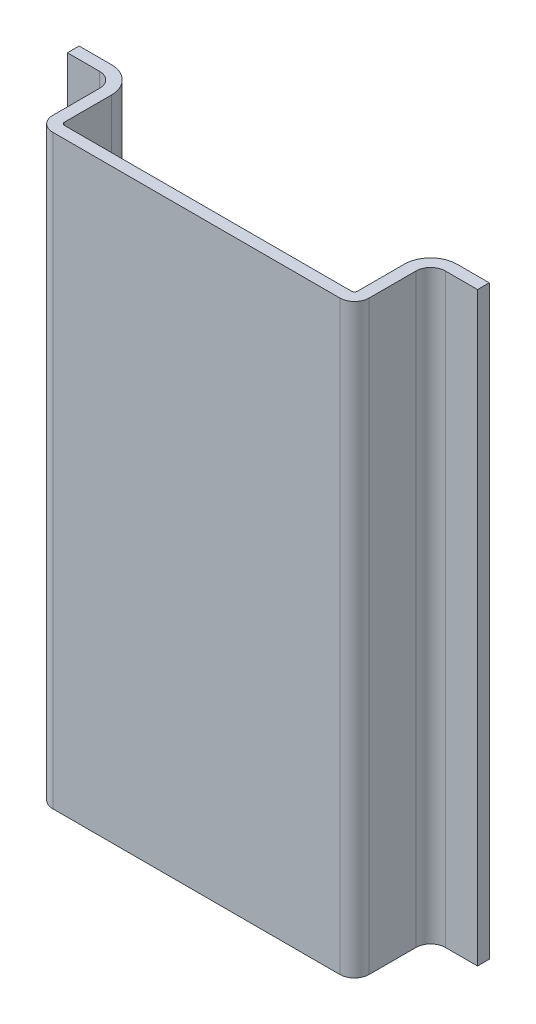
ISO-10303-21;
HEADER;
FILE_DESCRIPTION(('STEP AP214'),'2;1');
FILE_NAME('part.step','',(''),(''),'','','');
FILE_SCHEMA(('AUTOMOTIVE_DESIGN { 1 0 10303 214 1 1 1 1 }'));
ENDSEC;
DATA;
#1=APPLICATION_CONTEXT('core data for automotive mechanical design processes');
#2=APPLICATION_PROTOCOL_DEFINITION('international standard','automotive_design',2000,#1);
#3=PRODUCT_CONTEXT('',#1,'mechanical');
#4=PRODUCT('Part','Part','',(#3));
#5=PRODUCT_RELATED_PRODUCT_CATEGORY('part','',(#4));
#6=PRODUCT_DEFINITION_FORMATION('','',#4);
#7=PRODUCT_DEFINITION_CONTEXT('part definition',#1,'design');
#8=PRODUCT_DEFINITION('design','',#6,#7);
#9=PRODUCT_DEFINITION_SHAPE('','',#8);
#10=(LENGTH_UNIT() NAMED_UNIT(*) SI_UNIT(.MILLI.,.METRE.));
#11=(NAMED_UNIT(*) PLANE_ANGLE_UNIT() SI_UNIT($,.RADIAN.));
#12=(NAMED_UNIT(*) SI_UNIT($,.STERADIAN.) SOLID_ANGLE_UNIT());
#13=UNCERTAINTY_MEASURE_WITH_UNIT(LENGTH_MEASURE(1.E-05),#10,'distance_accuracy_value','');
#14=(GEOMETRIC_REPRESENTATION_CONTEXT(3) GLOBAL_UNCERTAINTY_ASSIGNED_CONTEXT((#13)) GLOBAL_UNIT_ASSIGNED_CONTEXT((#10,
#11,#12)) REPRESENTATION_CONTEXT('',''));
#15=CARTESIAN_POINT('',(0.,0.,0.));
#16=DIRECTION('',(0.,0.,1.));
#17=DIRECTION('',(1.,0.,0.));
#18=AXIS2_PLACEMENT_3D('',#15,#16,#17);
#19=CARTESIAN_POINT('',(17.5,50.,-6.50000000000017));
#20=DIRECTION('',(-1.,0.,0.));
#21=DIRECTION('',(0.,0.,1.));
#22=AXIS2_PLACEMENT_3D('',#19,#20,#21);
#23=PLANE('',#22);
#24=DIRECTION('',(0.,0.,-1.));
#25=VECTOR('',#24,1.);
#26=CARTESIAN_POINT('',(17.5,0.,-6.50000000000017));
#27=LINE('',#26,#25);
#28=CARTESIAN_POINT('',(17.5,0.,-6.50000000000017));
#29=VERTEX_POINT('',#28);
#30=CARTESIAN_POINT('',(17.5,0.,-7.5));
#31=VERTEX_POINT('',#30);
#32=EDGE_CURVE('E270',#29,#31,#27,.T.);
#33=ORIENTED_EDGE('',*,*,#32,.T.);
#34=DIRECTION('',(0.,-1.,0.));
#35=VECTOR('',#34,1.);
#36=CARTESIAN_POINT('',(17.5,50.,-7.5));
#37=LINE('',#36,#35);
#38=CARTESIAN_POINT('',(17.5,50.,-7.5));
#39=VERTEX_POINT('',#38);
#40=EDGE_CURVE('E13',#39,#31,#37,.T.);
#41=ORIENTED_EDGE('',*,*,#40,.F.);
#42=DIRECTION('',(0.,0.,-1.));
#43=VECTOR('',#42,1.);
#44=CARTESIAN_POINT('',(17.5,50.,-6.50000000000017));
#45=LINE('',#44,#43);
#46=CARTESIAN_POINT('',(17.5,50.,-6.50000000000017));
#47=VERTEX_POINT('',#46);
#48=EDGE_CURVE('E308',#47,#39,#45,.T.);
#49=ORIENTED_EDGE('',*,*,#48,.F.);
#50=DIRECTION('',(0.,-1.,0.));
#51=VECTOR('',#50,1.);
#52=CARTESIAN_POINT('',(17.5,50.,-6.50000000000017));
#53=LINE('',#52,#51);
#54=EDGE_CURVE('E266',#47,#29,#53,.T.);
#55=ORIENTED_EDGE('',*,*,#54,.T.);
#56=EDGE_LOOP('',(#33,#41,#49,#55));
#57=FACE_BOUND('',#56,.T.);
#58=ADVANCED_FACE('F102',(#57),#23,.F.);
#59=CARTESIAN_POINT('',(14.75,50.,-7.5));
#60=DIRECTION('',(0.,0.,1.));
#61=DIRECTION('',(1.,0.,0.));
#62=AXIS2_PLACEMENT_3D('',#59,#60,#61);
#63=PLANE('',#62);
#64=DIRECTION('',(-1.,0.,0.));
#65=VECTOR('',#64,1.);
#66=CARTESIAN_POINT('',(14.75,0.,-7.5));
#67=LINE('',#66,#65);
#68=CARTESIAN_POINT('',(14.75,0.,-7.5));
#69=VERTEX_POINT('',#68);
#70=EDGE_CURVE('E273',#31,#69,#67,.T.);
#71=ORIENTED_EDGE('',*,*,#70,.T.);
#72=DIRECTION('',(0.,-1.,0.));
#73=VECTOR('',#72,1.);
#74=CARTESIAN_POINT('',(14.75,50.,-7.5));
#75=LINE('',#74,#73);
#76=CARTESIAN_POINT('',(14.75,50.,-7.5));
#77=VERTEX_POINT('',#76);
#78=EDGE_CURVE('E110',#77,#69,#75,.T.);
#79=ORIENTED_EDGE('',*,*,#78,.F.);
#80=DIRECTION('',(-1.,0.,0.));
#81=VECTOR('',#80,1.);
#82=CARTESIAN_POINT('',(14.75,50.,-7.5));
#83=LINE('',#82,#81);
#84=EDGE_CURVE('E197',#39,#77,#83,.T.);
#85=ORIENTED_EDGE('',*,*,#84,.F.);
#86=ORIENTED_EDGE('',*,*,#40,.T.);
#87=EDGE_LOOP('',(#71,#79,#85,#86));
#88=FACE_BOUND('',#87,.T.);
#89=ADVANCED_FACE('F426',(#88),#63,.F.);
#90=CARTESIAN_POINT('',(14.75,50.,-5.25));
#91=DIRECTION('',(0.,-1.,0.));
#92=DIRECTION('',(0.,0.,-1.));
#93=AXIS2_PLACEMENT_3D('',#90,#91,#92);
#94=CYLINDRICAL_SURFACE('',#93,2.25);
#95=CARTESIAN_POINT('',(14.75,0.,-5.25));
#96=DIRECTION('',(0.,1.,0.));
#97=DIRECTION('',(0.,0.,-1.));
#98=AXIS2_PLACEMENT_3D('',#95,#96,#97);
#99=CIRCLE('',#98,2.25);
#100=CARTESIAN_POINT('',(12.5,0.,-5.24999999999998));
#101=VERTEX_POINT('',#100);
#102=EDGE_CURVE('E275',#69,#101,#99,.T.);
#103=ORIENTED_EDGE('',*,*,#102,.T.);
#104=DIRECTION('',(0.,-1.,0.));
#105=VECTOR('',#104,1.);
#106=CARTESIAN_POINT('',(12.5,50.,-5.24999999999998));
#107=LINE('',#106,#105);
#108=CARTESIAN_POINT('',(12.5,50.,-5.24999999999998));
#109=VERTEX_POINT('',#108);
#110=EDGE_CURVE('E351',#109,#101,#107,.T.);
#111=ORIENTED_EDGE('',*,*,#110,.F.);
#112=CARTESIAN_POINT('',(14.75,50.,-5.25));
#113=DIRECTION('',(0.,1.,0.));
#114=DIRECTION('',(0.,0.,-1.));
#115=AXIS2_PLACEMENT_3D('',#112,#113,#114);
#116=CIRCLE('',#115,2.25);
#117=EDGE_CURVE('E359',#77,#109,#116,.T.);
#118=ORIENTED_EDGE('',*,*,#117,.F.);
#119=ORIENTED_EDGE('',*,*,#78,.T.);
#120=EDGE_LOOP('',(#103,#111,#118,#119));
#121=FACE_BOUND('',#120,.T.);
#122=ADVANCED_FACE('F357',(#121),#94,.T.);
#123=CARTESIAN_POINT('',(12.5,50.,-1.24999999999999));
#124=DIRECTION('',(1.,0.,0.));
#125=DIRECTION('',(0.,0.,-1.));
#126=AXIS2_PLACEMENT_3D('',#123,#124,#125);
#127=PLANE('',#126);
#128=DIRECTION('',(0.,0.,1.));
#129=VECTOR('',#128,1.);
#130=CARTESIAN_POINT('',(12.5,0.,-1.24999999999999));
#131=LINE('',#130,#129);
#132=CARTESIAN_POINT('',(12.5,0.,-1.24999999999999));
#133=VERTEX_POINT('',#132);
#134=EDGE_CURVE('E277',#101,#133,#131,.T.);
#135=ORIENTED_EDGE('',*,*,#134,.T.);
#136=DIRECTION('',(0.,-1.,0.));
#137=VECTOR('',#136,1.);
#138=CARTESIAN_POINT('',(12.5,50.,-1.24999999999999));
#139=LINE('',#138,#137);
#140=CARTESIAN_POINT('',(12.5,50.,-1.24999999999999));
#141=VERTEX_POINT('',#140);
#142=EDGE_CURVE('E348',#141,#133,#139,.T.);
#143=ORIENTED_EDGE('',*,*,#142,.F.);
#144=DIRECTION('',(0.,0.,1.));
#145=VECTOR('',#144,1.);
#146=CARTESIAN_POINT('',(12.5,50.,-1.24999999999999));
#147=LINE('',#146,#145);
#148=EDGE_CURVE('E377',#109,#141,#147,.T.);
#149=ORIENTED_EDGE('',*,*,#148,.F.);
#150=ORIENTED_EDGE('',*,*,#110,.T.);
#151=EDGE_LOOP('',(#135,#143,#149,#150));
#152=FACE_BOUND('',#151,.T.);
#153=ADVANCED_FACE('F368',(#152),#127,.F.);
#154=CARTESIAN_POINT('',(12.25,50.,-1.24999999999997));
#155=DIRECTION('',(0.,-1.,0.));
#156=DIRECTION('',(0.,0.,-1.));
#157=AXIS2_PLACEMENT_3D('',#154,#155,#156);
#158=CYLINDRICAL_SURFACE('',#157,0.25);
#159=CARTESIAN_POINT('',(12.25,0.,-1.24999999999997));
#160=DIRECTION('',(0.,-1.,0.));
#161=DIRECTION('',(0.,0.,1.));
#162=AXIS2_PLACEMENT_3D('',#159,#160,#161);
#163=CIRCLE('',#162,0.25);
#164=CARTESIAN_POINT('',(12.25,0.,-0.999999999999966));
#165=VERTEX_POINT('',#164);
#166=EDGE_CURVE('E279',#133,#165,#163,.T.);
#167=ORIENTED_EDGE('',*,*,#166,.T.);
#168=DIRECTION('',(0.,-1.,0.));
#169=VECTOR('',#168,1.);
#170=CARTESIAN_POINT('',(12.25,50.,-0.999999999999966));
#171=LINE('',#170,#169);
#172=CARTESIAN_POINT('',(12.25,50.,-0.999999999999966));
#173=VERTEX_POINT('',#172);
#174=EDGE_CURVE('E345',#173,#165,#171,.T.);
#175=ORIENTED_EDGE('',*,*,#174,.F.);
#176=CARTESIAN_POINT('',(12.25,50.,-1.24999999999997));
#177=DIRECTION('',(0.,-1.,0.));
#178=DIRECTION('',(0.,0.,1.));
#179=AXIS2_PLACEMENT_3D('',#176,#177,#178);
#180=CIRCLE('',#179,0.25);
#181=EDGE_CURVE('E374',#141,#173,#180,.T.);
#182=ORIENTED_EDGE('',*,*,#181,.F.);
#183=ORIENTED_EDGE('',*,*,#142,.T.);
#184=EDGE_LOOP('',(#167,#175,#182,#183));
#185=FACE_BOUND('',#184,.T.);
#186=ADVANCED_FACE('F372',(#185),#158,.F.);
#187=CARTESIAN_POINT('',(12.25,50.,-0.999999999999966));
#188=DIRECTION('',(0.,0.,1.));
#189=DIRECTION('',(1.,0.,0.));
#190=AXIS2_PLACEMENT_3D('',#187,#188,#189);
#191=PLANE('',#190);
#192=DIRECTION('',(-1.,0.,0.));
#193=VECTOR('',#192,1.);
#194=CARTESIAN_POINT('',(12.25,0.,-0.999999999999966));
#195=LINE('',#194,#193);
#196=CARTESIAN_POINT('',(-12.25,0.,-0.999999999999964));
#197=VERTEX_POINT('',#196);
#198=EDGE_CURVE('E281',#165,#197,#195,.T.);
#199=ORIENTED_EDGE('',*,*,#198,.T.);
#200=DIRECTION('',(0.,-1.,0.));
#201=VECTOR('',#200,1.);
#202=CARTESIAN_POINT('',(-12.25,50.,-0.999999999999964));
#203=LINE('',#202,#201);
#204=CARTESIAN_POINT('',(-12.25,50.,-0.999999999999964));
#205=VERTEX_POINT('',#204);
#206=EDGE_CURVE('E342',#205,#197,#203,.T.);
#207=ORIENTED_EDGE('',*,*,#206,.F.);
#208=DIRECTION('',(-1.,0.,0.));
#209=VECTOR('',#208,1.);
#210=CARTESIAN_POINT('',(12.25,50.,-0.999999999999966));
#211=LINE('',#210,#209);
#212=EDGE_CURVE('E376',#173,#205,#211,.T.);
#213=ORIENTED_EDGE('',*,*,#212,.F.);
#214=ORIENTED_EDGE('',*,*,#174,.T.);
#215=EDGE_LOOP('',(#199,#207,#213,#214));
#216=FACE_BOUND('',#215,.T.);
#217=ADVANCED_FACE('F439',(#216),#191,.F.);
#218=CARTESIAN_POINT('',(-12.25,50.,-1.24999999999996));
#219=DIRECTION('',(0.,-1.,0.));
#220=DIRECTION('',(0.,0.,-1.));
#221=AXIS2_PLACEMENT_3D('',#218,#219,#220);
#222=CYLINDRICAL_SURFACE('',#221,0.25);
#223=CARTESIAN_POINT('',(-12.25,0.,-1.24999999999996));
#224=DIRECTION('',(0.,-1.,0.));
#225=DIRECTION('',(0.,0.,-1.));
#226=AXIS2_PLACEMENT_3D('',#223,#224,#225);
#227=CIRCLE('',#226,0.25);
#228=CARTESIAN_POINT('',(-12.5,0.,-1.24999999999996));
#229=VERTEX_POINT('',#228);
#230=EDGE_CURVE('E283',#197,#229,#227,.T.);
#231=ORIENTED_EDGE('',*,*,#230,.T.);
#232=DIRECTION('',(0.,-1.,0.));
#233=VECTOR('',#232,1.);
#234=CARTESIAN_POINT('',(-12.5,50.,-1.24999999999996));
#235=LINE('',#234,#233);
#236=CARTESIAN_POINT('',(-12.5,50.,-1.24999999999996));
#237=VERTEX_POINT('',#236);
#238=EDGE_CURVE('E339',#237,#229,#235,.T.);
#239=ORIENTED_EDGE('',*,*,#238,.F.);
#240=CARTESIAN_POINT('',(-12.25,50.,-1.24999999999996));
#241=DIRECTION('',(0.,-1.,0.));
#242=DIRECTION('',(0.,0.,-1.));
#243=AXIS2_PLACEMENT_3D('',#240,#241,#242);
#244=CIRCLE('',#243,0.25);
#245=EDGE_CURVE('E379',#205,#237,#244,.T.);
#246=ORIENTED_EDGE('',*,*,#245,.F.);
#247=ORIENTED_EDGE('',*,*,#206,.T.);
#248=EDGE_LOOP('',(#231,#239,#246,#247));
#249=FACE_BOUND('',#248,.T.);
#250=ADVANCED_FACE('F442',(#249),#222,.F.);
#251=CARTESIAN_POINT('',(-12.5,50.,-1.24999999999996));
#252=DIRECTION('',(-1.,0.,0.));
#253=DIRECTION('',(0.,0.,1.));
#254=AXIS2_PLACEMENT_3D('',#251,#252,#253);
#255=PLANE('',#254);
#256=DIRECTION('',(0.,0.,-1.));
#257=VECTOR('',#256,1.);
#258=CARTESIAN_POINT('',(-12.5,0.,-1.24999999999996));
#259=LINE('',#258,#257);
#260=CARTESIAN_POINT('',(-12.5,0.,-5.24999999999997));
#261=VERTEX_POINT('',#260);
#262=EDGE_CURVE('E285',#229,#261,#259,.T.);
#263=ORIENTED_EDGE('',*,*,#262,.T.);
#264=DIRECTION('',(0.,-1.,0.));
#265=VECTOR('',#264,1.);
#266=CARTESIAN_POINT('',(-12.5,50.,-5.24999999999997));
#267=LINE('',#266,#265);
#268=CARTESIAN_POINT('',(-12.5,50.,-5.24999999999997));
#269=VERTEX_POINT('',#268);
#270=EDGE_CURVE('E336',#269,#261,#267,.T.);
#271=ORIENTED_EDGE('',*,*,#270,.F.);
#272=DIRECTION('',(0.,0.,-1.));
#273=VECTOR('',#272,1.);
#274=CARTESIAN_POINT('',(-12.5,50.,-1.24999999999996));
#275=LINE('',#274,#273);
#276=EDGE_CURVE('E385',#237,#269,#275,.T.);
#277=ORIENTED_EDGE('',*,*,#276,.F.);
#278=ORIENTED_EDGE('',*,*,#238,.T.);
#279=EDGE_LOOP('',(#263,#271,#277,#278));
#280=FACE_BOUND('',#279,.T.);
#281=ADVANCED_FACE('F446',(#280),#255,.F.);
#282=CARTESIAN_POINT('',(-14.75,50.,-5.24999999999996));
#283=DIRECTION('',(0.,-1.,0.));
#284=DIRECTION('',(0.,0.,-1.));
#285=AXIS2_PLACEMENT_3D('',#282,#283,#284);
#286=CYLINDRICAL_SURFACE('',#285,2.25);
#287=CARTESIAN_POINT('',(-14.75,0.,-5.24999999999996));
#288=DIRECTION('',(0.,1.,0.));
#289=DIRECTION('',(0.,0.,-1.));
#290=AXIS2_PLACEMENT_3D('',#287,#288,#289);
#291=CIRCLE('',#290,2.25);
#292=CARTESIAN_POINT('',(-14.75,0.,-7.49999999999996));
#293=VERTEX_POINT('',#292);
#294=EDGE_CURVE('E287',#261,#293,#291,.T.);
#295=ORIENTED_EDGE('',*,*,#294,.T.);
#296=DIRECTION('',(0.,-1.,0.));
#297=VECTOR('',#296,1.);
#298=CARTESIAN_POINT('',(-14.75,50.,-7.49999999999996));
#299=LINE('',#298,#297);
#300=CARTESIAN_POINT('',(-14.75,50.,-7.49999999999996));
#301=VERTEX_POINT('',#300);
#302=EDGE_CURVE('E333',#301,#293,#299,.T.);
#303=ORIENTED_EDGE('',*,*,#302,.F.);
#304=CARTESIAN_POINT('',(-14.75,50.,-5.24999999999996));
#305=DIRECTION('',(0.,1.,0.));
#306=DIRECTION('',(0.,0.,-1.));
#307=AXIS2_PLACEMENT_3D('',#304,#305,#306);
#308=CIRCLE('',#307,2.25);
#309=EDGE_CURVE('E387',#269,#301,#308,.T.);
#310=ORIENTED_EDGE('',*,*,#309,.F.);
#311=ORIENTED_EDGE('',*,*,#270,.T.);
#312=EDGE_LOOP('',(#295,#303,#310,#311));
#313=FACE_BOUND('',#312,.T.);
#314=ADVANCED_FACE('F450',(#313),#286,.T.);
#315=CARTESIAN_POINT('',(-14.75,50.,-7.49999999999996));
#316=DIRECTION('',(0.,0.,1.));
#317=DIRECTION('',(1.,0.,0.));
#318=AXIS2_PLACEMENT_3D('',#315,#316,#317);
#319=PLANE('',#318);
#320=DIRECTION('',(-1.,0.,0.));
#321=VECTOR('',#320,1.);
#322=CARTESIAN_POINT('',(-14.75,0.,-7.49999999999996));
#323=LINE('',#322,#321);
#324=CARTESIAN_POINT('',(-17.5,0.,-7.49999999999996));
#325=VERTEX_POINT('',#324);
#326=EDGE_CURVE('E289',#293,#325,#323,.T.);
#327=ORIENTED_EDGE('',*,*,#326,.T.);
#328=DIRECTION('',(0.,-1.,0.));
#329=VECTOR('',#328,1.);
#330=CARTESIAN_POINT('',(-17.5,50.,-7.49999999999996));
#331=LINE('',#330,#329);
#332=CARTESIAN_POINT('',(-17.5,50.,-7.49999999999996));
#333=VERTEX_POINT('',#332);
#334=EDGE_CURVE('E330',#333,#325,#331,.T.);
#335=ORIENTED_EDGE('',*,*,#334,.F.);
#336=DIRECTION('',(-1.,0.,0.));
#337=VECTOR('',#336,1.);
#338=CARTESIAN_POINT('',(-14.75,50.,-7.49999999999996));
#339=LINE('',#338,#337);
#340=EDGE_CURVE('E389',#301,#333,#339,.T.);
#341=ORIENTED_EDGE('',*,*,#340,.F.);
#342=ORIENTED_EDGE('',*,*,#302,.T.);
#343=EDGE_LOOP('',(#327,#335,#341,#342));
#344=FACE_BOUND('',#343,.T.);
#345=ADVANCED_FACE('F454',(#344),#319,.F.);
#346=CARTESIAN_POINT('',(-17.5,50.,-6.49999999999986));
#347=DIRECTION('',(1.,0.,0.));
#348=DIRECTION('',(0.,0.,-1.));
#349=AXIS2_PLACEMENT_3D('',#346,#347,#348);
#350=PLANE('',#349);
#351=DIRECTION('',(0.,0.,1.));
#352=VECTOR('',#351,1.);
#353=CARTESIAN_POINT('',(-17.5,0.,-6.49999999999986));
#354=LINE('',#353,#352);
#355=CARTESIAN_POINT('',(-17.5,0.,-6.49999999999986));
#356=VERTEX_POINT('',#355);
#357=EDGE_CURVE('E291',#325,#356,#354,.T.);
#358=ORIENTED_EDGE('',*,*,#357,.T.);
#359=DIRECTION('',(0.,-1.,0.));
#360=VECTOR('',#359,1.);
#361=CARTESIAN_POINT('',(-17.5,50.,-6.49999999999986));
#362=LINE('',#361,#360);
#363=CARTESIAN_POINT('',(-17.5,50.,-6.49999999999986));
#364=VERTEX_POINT('',#363);
#365=EDGE_CURVE('E327',#364,#356,#362,.T.);
#366=ORIENTED_EDGE('',*,*,#365,.F.);
#367=DIRECTION('',(0.,0.,1.));
#368=VECTOR('',#367,1.);
#369=CARTESIAN_POINT('',(-17.5,50.,-6.49999999999986));
#370=LINE('',#369,#368);
#371=EDGE_CURVE('E391',#333,#364,#370,.T.);
#372=ORIENTED_EDGE('',*,*,#371,.F.);
#373=ORIENTED_EDGE('',*,*,#334,.T.);
#374=EDGE_LOOP('',(#358,#366,#372,#373));
#375=FACE_BOUND('',#374,.T.);
#376=ADVANCED_FACE('F458',(#375),#350,.F.);
#377=CARTESIAN_POINT('',(-14.75,50.,-6.49999999999986));
#378=DIRECTION('',(0.,0.,-1.));
#379=DIRECTION('',(-1.,0.,0.));
#380=AXIS2_PLACEMENT_3D('',#377,#378,#379);
#381=PLANE('',#380);
#382=DIRECTION('',(1.,0.,0.));
#383=VECTOR('',#382,1.);
#384=CARTESIAN_POINT('',(-14.75,0.,-6.49999999999986));
#385=LINE('',#384,#383);
#386=CARTESIAN_POINT('',(-14.75,0.,-6.49999999999986));
#387=VERTEX_POINT('',#386);
#388=EDGE_CURVE('E293',#356,#387,#385,.T.);
#389=ORIENTED_EDGE('',*,*,#388,.T.);
#390=DIRECTION('',(0.,-1.,0.));
#391=VECTOR('',#390,1.);
#392=CARTESIAN_POINT('',(-14.75,50.,-6.49999999999986));
#393=LINE('',#392,#391);
#394=CARTESIAN_POINT('',(-14.75,50.,-6.49999999999986));
#395=VERTEX_POINT('',#394);
#396=EDGE_CURVE('E324',#395,#387,#393,.T.);
#397=ORIENTED_EDGE('',*,*,#396,.F.);
#398=DIRECTION('',(1.,0.,0.));
#399=VECTOR('',#398,1.);
#400=CARTESIAN_POINT('',(-14.75,50.,-6.49999999999986));
#401=LINE('',#400,#399);
#402=EDGE_CURVE('E393',#364,#395,#401,.T.);
#403=ORIENTED_EDGE('',*,*,#402,.F.);
#404=ORIENTED_EDGE('',*,*,#365,.T.);
#405=EDGE_LOOP('',(#389,#397,#403,#404));
#406=FACE_BOUND('',#405,.T.);
#407=ADVANCED_FACE('F462',(#406),#381,.F.);
#408=CARTESIAN_POINT('',(-14.75,50.,-5.24999999999986));
#409=DIRECTION('',(0.,-1.,0.));
#410=DIRECTION('',(0.,0.,-1.));
#411=AXIS2_PLACEMENT_3D('',#408,#409,#410);
#412=CYLINDRICAL_SURFACE('',#411,1.25);
#413=CARTESIAN_POINT('',(-14.75,0.,-5.24999999999986));
#414=DIRECTION('',(0.,-1.,0.));
#415=DIRECTION('',(0.,0.,-1.));
#416=AXIS2_PLACEMENT_3D('',#413,#414,#415);
#417=CIRCLE('',#416,1.25);
#418=CARTESIAN_POINT('',(-13.5,0.,-5.24999999999986));
#419=VERTEX_POINT('',#418);
#420=EDGE_CURVE('E295',#387,#419,#417,.T.);
#421=ORIENTED_EDGE('',*,*,#420,.T.);
#422=DIRECTION('',(0.,-1.,0.));
#423=VECTOR('',#422,1.);
#424=CARTESIAN_POINT('',(-13.5,50.,-5.24999999999986));
#425=LINE('',#424,#423);
#426=CARTESIAN_POINT('',(-13.5,50.,-5.24999999999986));
#427=VERTEX_POINT('',#426);
#428=EDGE_CURVE('E321',#427,#419,#425,.T.);
#429=ORIENTED_EDGE('',*,*,#428,.F.);
#430=CARTESIAN_POINT('',(-14.75,50.,-5.24999999999986));
#431=DIRECTION('',(0.,-1.,0.));
#432=DIRECTION('',(0.,0.,-1.));
#433=AXIS2_PLACEMENT_3D('',#430,#431,#432);
#434=CIRCLE('',#433,1.25);
#435=EDGE_CURVE('E395',#395,#427,#434,.T.);
#436=ORIENTED_EDGE('',*,*,#435,.F.);
#437=ORIENTED_EDGE('',*,*,#396,.T.);
#438=EDGE_LOOP('',(#421,#429,#436,#437));
#439=FACE_BOUND('',#438,.T.);
#440=ADVANCED_FACE('F466',(#439),#412,.F.);
#441=CARTESIAN_POINT('',(-13.5,50.,-1.25));
#442=DIRECTION('',(1.,0.,0.));
#443=DIRECTION('',(0.,0.,-1.));
#444=AXIS2_PLACEMENT_3D('',#441,#442,#443);
#445=PLANE('',#444);
#446=DIRECTION('',(0.,0.,1.));
#447=VECTOR('',#446,1.);
#448=CARTESIAN_POINT('',(-13.5,0.,-1.25));
#449=LINE('',#448,#447);
#450=CARTESIAN_POINT('',(-13.5,0.,-1.25));
#451=VERTEX_POINT('',#450);
#452=EDGE_CURVE('E297',#419,#451,#449,.T.);
#453=ORIENTED_EDGE('',*,*,#452,.T.);
#454=DIRECTION('',(0.,-1.,0.));
#455=VECTOR('',#454,1.);
#456=CARTESIAN_POINT('',(-13.5,50.,-1.25));
#457=LINE('',#456,#455);
#458=CARTESIAN_POINT('',(-13.5,50.,-1.25));
#459=VERTEX_POINT('',#458);
#460=EDGE_CURVE('E318',#459,#451,#457,.T.);
#461=ORIENTED_EDGE('',*,*,#460,.F.);
#462=DIRECTION('',(0.,0.,1.));
#463=VECTOR('',#462,1.);
#464=CARTESIAN_POINT('',(-13.5,50.,-1.25));
#465=LINE('',#464,#463);
#466=EDGE_CURVE('E397',#427,#459,#465,.T.);
#467=ORIENTED_EDGE('',*,*,#466,.F.);
#468=ORIENTED_EDGE('',*,*,#428,.T.);
#469=EDGE_LOOP('',(#453,#461,#467,#468));
#470=FACE_BOUND('',#469,.T.);
#471=ADVANCED_FACE('F470',(#470),#445,.F.);
#472=CARTESIAN_POINT('',(-12.25,50.,-1.25));
#473=DIRECTION('',(0.,-1.,0.));
#474=DIRECTION('',(0.,0.,-1.));
#475=AXIS2_PLACEMENT_3D('',#472,#473,#474);
#476=CYLINDRICAL_SURFACE('',#475,1.25);
#477=CARTESIAN_POINT('',(-12.25,0.,-1.25));
#478=DIRECTION('',(0.,1.,0.));
#479=DIRECTION('',(0.,0.,-1.));
#480=AXIS2_PLACEMENT_3D('',#477,#478,#479);
#481=CIRCLE('',#480,1.25);
#482=CARTESIAN_POINT('',(-12.25,0.,0.));
#483=VERTEX_POINT('',#482);
#484=EDGE_CURVE('E299',#451,#483,#481,.T.);
#485=ORIENTED_EDGE('',*,*,#484,.T.);
#486=DIRECTION('',(0.,-1.,0.));
#487=VECTOR('',#486,1.);
#488=CARTESIAN_POINT('',(-12.25,50.,0.));
#489=LINE('',#488,#487);
#490=CARTESIAN_POINT('',(-12.25,50.,0.));
#491=VERTEX_POINT('',#490);
#492=EDGE_CURVE('E315',#491,#483,#489,.T.);
#493=ORIENTED_EDGE('',*,*,#492,.F.);
#494=CARTESIAN_POINT('',(-12.25,50.,-1.25));
#495=DIRECTION('',(0.,1.,0.));
#496=DIRECTION('',(0.,0.,-1.));
#497=AXIS2_PLACEMENT_3D('',#494,#495,#496);
#498=CIRCLE('',#497,1.25);
#499=EDGE_CURVE('E399',#459,#491,#498,.T.);
#500=ORIENTED_EDGE('',*,*,#499,.F.);
#501=ORIENTED_EDGE('',*,*,#460,.T.);
#502=EDGE_LOOP('',(#485,#493,#500,#501));
#503=FACE_BOUND('',#502,.T.);
#504=ADVANCED_FACE('F474',(#503),#476,.T.);
#505=CARTESIAN_POINT('',(12.25,50.,0.));
#506=DIRECTION('',(0.,0.,-1.));
#507=DIRECTION('',(-1.,0.,0.));
#508=AXIS2_PLACEMENT_3D('',#505,#506,#507);
#509=PLANE('',#508);
#510=DIRECTION('',(1.,0.,0.));
#511=VECTOR('',#510,1.);
#512=CARTESIAN_POINT('',(12.25,0.,0.));
#513=LINE('',#512,#511);
#514=CARTESIAN_POINT('',(12.25,0.,0.));
#515=VERTEX_POINT('',#514);
#516=EDGE_CURVE('E301',#483,#515,#513,.T.);
#517=ORIENTED_EDGE('',*,*,#516,.T.);
#518=DIRECTION('',(0.,-1.,0.));
#519=VECTOR('',#518,1.);
#520=CARTESIAN_POINT('',(12.25,50.,0.));
#521=LINE('',#520,#519);
#522=CARTESIAN_POINT('',(12.25,50.,0.));
#523=VERTEX_POINT('',#522);
#524=EDGE_CURVE('E312',#523,#515,#521,.T.);
#525=ORIENTED_EDGE('',*,*,#524,.F.);
#526=DIRECTION('',(1.,0.,0.));
#527=VECTOR('',#526,1.);
#528=CARTESIAN_POINT('',(12.25,50.,0.));
#529=LINE('',#528,#527);
#530=EDGE_CURVE('E401',#491,#523,#529,.T.);
#531=ORIENTED_EDGE('',*,*,#530,.F.);
#532=ORIENTED_EDGE('',*,*,#492,.T.);
#533=EDGE_LOOP('',(#517,#525,#531,#532));
#534=FACE_BOUND('',#533,.T.);
#535=ADVANCED_FACE('F407',(#534),#509,.F.);
#536=CARTESIAN_POINT('',(12.25,50.,-1.25));
#537=DIRECTION('',(0.,-1.,0.));
#538=DIRECTION('',(0.,0.,-1.));
#539=AXIS2_PLACEMENT_3D('',#536,#537,#538);
#540=CYLINDRICAL_SURFACE('',#539,1.24999999999998);
#541=CARTESIAN_POINT('',(12.25,0.,-1.25));
#542=DIRECTION('',(0.,1.,0.));
#543=DIRECTION('',(0.,0.,1.));
#544=AXIS2_PLACEMENT_3D('',#541,#542,#543);
#545=CIRCLE('',#544,1.24999999999998);
#546=CARTESIAN_POINT('',(13.5,0.,-1.25));
#547=VERTEX_POINT('',#546);
#548=EDGE_CURVE('E303',#515,#547,#545,.T.);
#549=ORIENTED_EDGE('',*,*,#548,.T.);
#550=DIRECTION('',(0.,-1.,0.));
#551=VECTOR('',#550,1.);
#552=CARTESIAN_POINT('',(13.5,50.,-1.25));
#553=LINE('',#552,#551);
#554=CARTESIAN_POINT('',(13.5,50.,-1.25));
#555=VERTEX_POINT('',#554);
#556=EDGE_CURVE('E261',#555,#547,#553,.T.);
#557=ORIENTED_EDGE('',*,*,#556,.F.);
#558=CARTESIAN_POINT('',(12.25,50.,-1.25));
#559=DIRECTION('',(0.,1.,0.));
#560=DIRECTION('',(0.,0.,1.));
#561=AXIS2_PLACEMENT_3D('',#558,#559,#560);
#562=CIRCLE('',#561,1.24999999999998);
#563=EDGE_CURVE('E252',#523,#555,#562,.T.);
#564=ORIENTED_EDGE('',*,*,#563,.F.);
#565=ORIENTED_EDGE('',*,*,#524,.T.);
#566=EDGE_LOOP('',(#549,#557,#564,#565));
#567=FACE_BOUND('',#566,.T.);
#568=ADVANCED_FACE('F411',(#567),#540,.T.);
#569=CARTESIAN_POINT('',(13.5,50.,-1.25));
#570=DIRECTION('',(-1.,0.,0.));
#571=DIRECTION('',(0.,0.,1.));
#572=AXIS2_PLACEMENT_3D('',#569,#570,#571);
#573=PLANE('',#572);
#574=DIRECTION('',(0.,0.,-1.));
#575=VECTOR('',#574,1.);
#576=CARTESIAN_POINT('',(13.5,0.,-1.25));
#577=LINE('',#576,#575);
#578=CARTESIAN_POINT('',(13.5,0.,-5.25000000000017));
#579=VERTEX_POINT('',#578);
#580=EDGE_CURVE('E260',#547,#579,#577,.T.);
#581=ORIENTED_EDGE('',*,*,#580,.T.);
#582=DIRECTION('',(0.,-1.,0.));
#583=VECTOR('',#582,1.);
#584=CARTESIAN_POINT('',(13.5,50.,-5.25000000000017));
#585=LINE('',#584,#583);
#586=CARTESIAN_POINT('',(13.5,50.,-5.25000000000017));
#587=VERTEX_POINT('',#586);
#588=EDGE_CURVE('E257',#587,#579,#585,.T.);
#589=ORIENTED_EDGE('',*,*,#588,.F.);
#590=DIRECTION('',(0.,0.,-1.));
#591=VECTOR('',#590,1.);
#592=CARTESIAN_POINT('',(13.5,50.,-1.25));
#593=LINE('',#592,#591);
#594=EDGE_CURVE('E246',#555,#587,#593,.T.);
#595=ORIENTED_EDGE('',*,*,#594,.F.);
#596=ORIENTED_EDGE('',*,*,#556,.T.);
#597=EDGE_LOOP('',(#581,#589,#595,#596));
#598=FACE_BOUND('',#597,.T.);
#599=ADVANCED_FACE('F258',(#598),#573,.F.);
#600=CARTESIAN_POINT('',(14.75,50.,-5.25000000000017));
#601=DIRECTION('',(0.,-1.,0.));
#602=DIRECTION('',(0.,0.,-1.));
#603=AXIS2_PLACEMENT_3D('',#600,#601,#602);
#604=CYLINDRICAL_SURFACE('',#603,1.25);
#605=CARTESIAN_POINT('',(14.75,0.,-5.25000000000017));
#606=DIRECTION('',(0.,-1.,0.));
#607=DIRECTION('',(0.,0.,-1.));
#608=AXIS2_PLACEMENT_3D('',#605,#606,#607);
#609=CIRCLE('',#608,1.25);
#610=CARTESIAN_POINT('',(14.75,0.,-6.50000000000017));
#611=VERTEX_POINT('',#610);
#612=EDGE_CURVE('E183',#579,#611,#609,.T.);
#613=ORIENTED_EDGE('',*,*,#612,.T.);
#614=DIRECTION('',(0.,-1.,0.));
#615=VECTOR('',#614,1.);
#616=CARTESIAN_POINT('',(14.75,50.,-6.50000000000017));
#617=LINE('',#616,#615);
#618=CARTESIAN_POINT('',(14.75,50.,-6.50000000000017));
#619=VERTEX_POINT('',#618);
#620=EDGE_CURVE('E262',#619,#611,#617,.T.);
#621=ORIENTED_EDGE('',*,*,#620,.F.);
#622=CARTESIAN_POINT('',(14.75,50.,-5.25000000000017));
#623=DIRECTION('',(0.,-1.,0.));
#624=DIRECTION('',(0.,0.,-1.));
#625=AXIS2_PLACEMENT_3D('',#622,#623,#624);
#626=CIRCLE('',#625,1.25);
#627=EDGE_CURVE('E250',#587,#619,#626,.T.);
#628=ORIENTED_EDGE('',*,*,#627,.F.);
#629=ORIENTED_EDGE('',*,*,#588,.T.);
#630=EDGE_LOOP('',(#613,#621,#628,#629));
#631=FACE_BOUND('',#630,.T.);
#632=ADVANCED_FACE('F264',(#631),#604,.F.);
#633=CARTESIAN_POINT('',(14.75,50.,-6.50000000000017));
#634=DIRECTION('',(0.,0.,-1.));
#635=DIRECTION('',(-1.,0.,0.));
#636=AXIS2_PLACEMENT_3D('',#633,#634,#635);
#637=PLANE('',#636);
#638=DIRECTION('',(1.,0.,0.));
#639=VECTOR('',#638,1.);
#640=CARTESIAN_POINT('',(14.75,0.,-6.50000000000017));
#641=LINE('',#640,#639);
#642=EDGE_CURVE('E189',#611,#29,#641,.T.);
#643=ORIENTED_EDGE('',*,*,#642,.T.);
#644=ORIENTED_EDGE('',*,*,#54,.F.);
#645=DIRECTION('',(1.,0.,0.));
#646=VECTOR('',#645,1.);
#647=CARTESIAN_POINT('',(14.75,50.,-6.50000000000017));
#648=LINE('',#647,#646);
#649=EDGE_CURVE('E118',#619,#47,#648,.T.);
#650=ORIENTED_EDGE('',*,*,#649,.F.);
#651=ORIENTED_EDGE('',*,*,#620,.T.);
#652=EDGE_LOOP('',(#643,#644,#650,#651));
#653=FACE_BOUND('',#652,.T.);
#654=ADVANCED_FACE('F415',(#653),#637,.F.);
#655=CARTESIAN_POINT('',(14.75,50.,-5.25));
#656=DIRECTION('',(0.,-1.,0.));
#657=DIRECTION('',(0.,0.,-1.));
#658=AXIS2_PLACEMENT_3D('',#655,#656,#657);
#659=PLANE('',#658);
#660=ORIENTED_EDGE('',*,*,#48,.T.);
#661=ORIENTED_EDGE('',*,*,#84,.T.);
#662=ORIENTED_EDGE('',*,*,#117,.T.);
#663=ORIENTED_EDGE('',*,*,#148,.T.);
#664=ORIENTED_EDGE('',*,*,#181,.T.);
#665=ORIENTED_EDGE('',*,*,#212,.T.);
#666=ORIENTED_EDGE('',*,*,#245,.T.);
#667=ORIENTED_EDGE('',*,*,#276,.T.);
#668=ORIENTED_EDGE('',*,*,#309,.T.);
#669=ORIENTED_EDGE('',*,*,#340,.T.);
#670=ORIENTED_EDGE('',*,*,#371,.T.);
#671=ORIENTED_EDGE('',*,*,#402,.T.);
#672=ORIENTED_EDGE('',*,*,#435,.T.);
#673=ORIENTED_EDGE('',*,*,#466,.T.);
#674=ORIENTED_EDGE('',*,*,#499,.T.);
#675=ORIENTED_EDGE('',*,*,#530,.T.);
#676=ORIENTED_EDGE('',*,*,#563,.T.);
#677=ORIENTED_EDGE('',*,*,#594,.T.);
#678=ORIENTED_EDGE('',*,*,#627,.T.);
#679=ORIENTED_EDGE('',*,*,#649,.T.);
#680=EDGE_LOOP('',(#660,#661,#662,#663,#664,#665,#666,#667,#668,#669,#670,#671,#672,#673,#674,
#675,#676,#677,#678,#679));
#681=FACE_BOUND('',#680,.T.);
#682=ADVANCED_FACE('F248',(#681),#659,.F.);
#683=CARTESIAN_POINT('',(14.75,0.,-5.25));
#684=DIRECTION('',(0.,-1.,0.));
#685=DIRECTION('',(0.,0.,-1.));
#686=AXIS2_PLACEMENT_3D('',#683,#684,#685);
#687=PLANE('',#686);
#688=ORIENTED_EDGE('',*,*,#32,.F.);
#689=ORIENTED_EDGE('',*,*,#642,.F.);
#690=ORIENTED_EDGE('',*,*,#612,.F.);
#691=ORIENTED_EDGE('',*,*,#580,.F.);
#692=ORIENTED_EDGE('',*,*,#548,.F.);
#693=ORIENTED_EDGE('',*,*,#516,.F.);
#694=ORIENTED_EDGE('',*,*,#484,.F.);
#695=ORIENTED_EDGE('',*,*,#452,.F.);
#696=ORIENTED_EDGE('',*,*,#420,.F.);
#697=ORIENTED_EDGE('',*,*,#388,.F.);
#698=ORIENTED_EDGE('',*,*,#357,.F.);
#699=ORIENTED_EDGE('',*,*,#326,.F.);
#700=ORIENTED_EDGE('',*,*,#294,.F.);
#701=ORIENTED_EDGE('',*,*,#262,.F.);
#702=ORIENTED_EDGE('',*,*,#230,.F.);
#703=ORIENTED_EDGE('',*,*,#198,.F.);
#704=ORIENTED_EDGE('',*,*,#166,.F.);
#705=ORIENTED_EDGE('',*,*,#134,.F.);
#706=ORIENTED_EDGE('',*,*,#102,.F.);
#707=ORIENTED_EDGE('',*,*,#70,.F.);
#708=EDGE_LOOP('',(#688,#689,#690,#691,#692,#693,#694,#695,#696,#697,#698,#699,#700,#701,#702,
#703,#704,#705,#706,#707));
#709=FACE_BOUND('',#708,.T.);
#710=ADVANCED_FACE('F363',(#709),#687,.T.);
#711=CLOSED_SHELL('',(#58,#89,#122,#153,#186,#217,#250,#281,#314,#345,#376,#407,#440,#471,#504,
#535,#568,#599,#632,#654,#682,#710));
#712=MANIFOLD_SOLID_BREP('B2',#711);
#713=ADVANCED_BREP_SHAPE_REPRESENTATION('',(#18,#712),#14);
#714=SHAPE_DEFINITION_REPRESENTATION(#9,#713);
ENDSEC;
END-ISO-10303-21;
